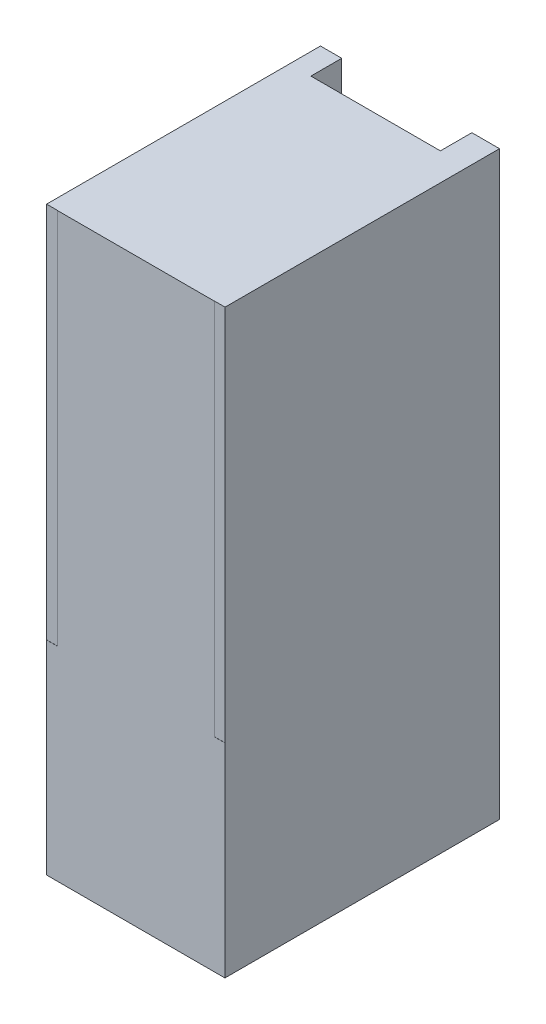
ISO-10303-21;
HEADER;
FILE_DESCRIPTION(('STEP AP214'),'2;1');
FILE_NAME('part.step','',(''),(''),'','','');
FILE_SCHEMA(('AUTOMOTIVE_DESIGN { 1 0 10303 214 1 1 1 1 }'));
ENDSEC;
DATA;
#1=APPLICATION_CONTEXT('core data for automotive mechanical design processes');
#2=APPLICATION_PROTOCOL_DEFINITION('international standard','automotive_design',2000,#1);
#3=PRODUCT_CONTEXT('',#1,'mechanical');
#4=PRODUCT('Part','Part','',(#3));
#5=PRODUCT_RELATED_PRODUCT_CATEGORY('part','',(#4));
#6=PRODUCT_DEFINITION_FORMATION('','',#4);
#7=PRODUCT_DEFINITION_CONTEXT('part definition',#1,'design');
#8=PRODUCT_DEFINITION('design','',#6,#7);
#9=PRODUCT_DEFINITION_SHAPE('','',#8);
#10=(LENGTH_UNIT() NAMED_UNIT(*) SI_UNIT(.MILLI.,.METRE.));
#11=(NAMED_UNIT(*) PLANE_ANGLE_UNIT() SI_UNIT($,.RADIAN.));
#12=(NAMED_UNIT(*) SI_UNIT($,.STERADIAN.) SOLID_ANGLE_UNIT());
#13=UNCERTAINTY_MEASURE_WITH_UNIT(LENGTH_MEASURE(1.E-05),#10,'distance_accuracy_value','');
#14=(GEOMETRIC_REPRESENTATION_CONTEXT(3) GLOBAL_UNCERTAINTY_ASSIGNED_CONTEXT((#13)) GLOBAL_UNIT_ASSIGNED_CONTEXT((#10,
#11,#12)) REPRESENTATION_CONTEXT('',''));
#15=CARTESIAN_POINT('',(0.,0.,0.));
#16=DIRECTION('',(0.,0.,1.));
#17=DIRECTION('',(1.,0.,0.));
#18=AXIS2_PLACEMENT_3D('',#15,#16,#17);
#19=CARTESIAN_POINT('',(4668.57723500689,-4124.1675232722,73.1581251567649));
#20=DIRECTION('',(0.,0.,-1.));
#21=DIRECTION('',(0.,1.,0.));
#22=AXIS2_PLACEMENT_3D('',#19,#20,#21);
#23=PLANE('',#22);
#24=DIRECTION('',(0.,-1.,0.));
#25=VECTOR('',#24,1.);
#26=CARTESIAN_POINT('',(4668.57723500689,-4124.1675232722,73.1581251567649));
#27=LINE('',#26,#25);
#28=CARTESIAN_POINT('',(4668.57723500689,-4242.94271249301,73.158125156767));
#29=VERTEX_POINT('',#28);
#30=CARTESIAN_POINT('',(4668.57723500689,-4304.10271249301,73.1581251567648));
#31=VERTEX_POINT('',#30);
#32=EDGE_CURVE('E38',#29,#31,#27,.T.);
#33=ORIENTED_EDGE('',*,*,#32,.F.);
#34=DIRECTION('',(-1.,0.,0.));
#35=VECTOR('',#34,1.);
#36=CARTESIAN_POINT('',(4668.57723500689,-4242.94271249301,73.1581251567649));
#37=LINE('',#36,#35);
#38=CARTESIAN_POINT('',(4643.17723500689,-4242.94271249301,73.1581251567649));
#39=VERTEX_POINT('',#38);
#40=EDGE_CURVE('E163',#29,#39,#37,.T.);
#41=ORIENTED_EDGE('',*,*,#40,.T.);
#42=DIRECTION('',(0.,-1.,0.));
#43=VECTOR('',#42,1.);
#44=CARTESIAN_POINT('',(4643.17723500689,-4124.1675232722,73.1581251567649));
#45=LINE('',#44,#43);
#46=CARTESIAN_POINT('',(4643.17723500689,-4304.10271249301,73.1581251567648));
#47=VERTEX_POINT('',#46);
#48=EDGE_CURVE('E168',#39,#47,#45,.T.);
#49=ORIENTED_EDGE('',*,*,#48,.T.);
#50=DIRECTION('',(-1.,0.,0.));
#51=VECTOR('',#50,1.);
#52=CARTESIAN_POINT('',(4670.29229527073,-4304.10271249301,73.1581251567648));
#53=LINE('',#52,#51);
#54=CARTESIAN_POINT('',(4641.36966826011,-4304.10271249301,73.1581251567648));
#55=VERTEX_POINT('',#54);
#56=EDGE_CURVE('E188',#47,#55,#53,.T.);
#57=ORIENTED_EDGE('',*,*,#56,.T.);
#58=DIRECTION('',(0.,-1.,0.));
#59=VECTOR('',#58,1.);
#60=CARTESIAN_POINT('',(4641.36966826011,-4304.10271249301,73.1581251567648));
#61=LINE('',#60,#59);
#62=CARTESIAN_POINT('',(4641.36966826011,-4337.10271249301,73.1581251567648));
#63=VERTEX_POINT('',#62);
#64=EDGE_CURVE('E186',#55,#63,#61,.T.);
#65=ORIENTED_EDGE('',*,*,#64,.T.);
#66=DIRECTION('',(-1.,0.,0.));
#67=VECTOR('',#66,1.);
#68=CARTESIAN_POINT('',(4641.36966826011,-4337.10271249301,73.1581251567648));
#69=LINE('',#68,#67);
#70=CARTESIAN_POINT('',(4670.29229527073,-4337.10271249301,73.1581251567648));
#71=VERTEX_POINT('',#70);
#72=EDGE_CURVE('E11',#71,#63,#69,.T.);
#73=ORIENTED_EDGE('',*,*,#72,.F.);
#74=DIRECTION('',(0.,-1.,0.));
#75=VECTOR('',#74,1.);
#76=CARTESIAN_POINT('',(4670.29229527073,-4304.10271249301,73.1581251567648));
#77=LINE('',#76,#75);
#78=CARTESIAN_POINT('',(4670.29229527073,-4304.10271249301,73.1581251567648));
#79=VERTEX_POINT('',#78);
#80=EDGE_CURVE('E181',#79,#71,#77,.T.);
#81=ORIENTED_EDGE('',*,*,#80,.F.);
#82=EDGE_CURVE('E179',#79,#31,#53,.T.);
#83=ORIENTED_EDGE('',*,*,#82,.T.);
#84=EDGE_LOOP('',(#33,#41,#49,#57,#65,#73,#81,#83));
#85=FACE_BOUND('',#84,.T.);
#86=ADVANCED_FACE('F34',(#85),#23,.F.);
#87=CARTESIAN_POINT('',(4655.23098177488,-4300.69152032911,38.7485333618752));
#88=DIRECTION('',(0.,0.,-1.));
#89=DIRECTION('',(0.,1.,0.));
#90=AXIS2_PLACEMENT_3D('',#87,#88,#89);
#91=PLANE('',#90);
#92=CARTESIAN_POINT('',(4655.23098177488,-4300.69152032911,38.7485333618752));
#93=DIRECTION('',(0.,0.,-1.));
#94=DIRECTION('',(0.,1.,0.));
#95=AXIS2_PLACEMENT_3D('',#92,#93,#94);
#96=CIRCLE('',#95,1.40000000000023);
#97=CARTESIAN_POINT('',(4655.23098177488,-4299.29152032911,38.7485333618752));
#98=VERTEX_POINT('',#97);
#99=EDGE_CURVE('E185',#98,#98,#96,.T.);
#100=ORIENTED_EDGE('',*,*,#99,.T.);
#101=EDGE_LOOP('',(#100));
#102=FACE_BOUND('',#101,.T.);
#103=ADVANCED_FACE('F362',(#102),#91,.T.);
#104=CARTESIAN_POINT('',(4655.23098177488,-4254.89152032911,38.7485333618752));
#105=DIRECTION('',(0.,0.,-1.));
#106=DIRECTION('',(0.,1.,0.));
#107=AXIS2_PLACEMENT_3D('',#104,#105,#106);
#108=PLANE('',#107);
#109=CARTESIAN_POINT('',(4655.23098177488,-4254.89152032911,38.7485333618752));
#110=DIRECTION('',(0.,0.,-1.));
#111=DIRECTION('',(0.,1.,0.));
#112=AXIS2_PLACEMENT_3D('',#109,#110,#111);
#113=CIRCLE('',#112,1.40000000000023);
#114=CARTESIAN_POINT('',(4655.23098177488,-4253.49152032911,38.7485333618752));
#115=VERTEX_POINT('',#114);
#116=EDGE_CURVE('E190',#115,#115,#113,.T.);
#117=ORIENTED_EDGE('',*,*,#116,.T.);
#118=EDGE_LOOP('',(#117));
#119=FACE_BOUND('',#118,.T.);
#120=ADVANCED_FACE('F364',(#119),#108,.T.);
#121=CARTESIAN_POINT('',(4655.23098177488,-4300.69152032911,38.7485333618752));
#122=DIRECTION('',(0.,0.,-1.));
#123=DIRECTION('',(0.,1.,0.));
#124=AXIS2_PLACEMENT_3D('',#121,#122,#123);
#125=CYLINDRICAL_SURFACE('',#124,1.40000000000023);
#126=ORIENTED_EDGE('',*,*,#99,.F.);
#127=EDGE_LOOP('',(#126));
#128=FACE_BOUND('',#127,.T.);
#129=CARTESIAN_POINT('',(4655.23098177488,-4300.69152032911,33.7485333618752));
#130=DIRECTION('',(0.,0.,-1.));
#131=DIRECTION('',(0.,1.,0.));
#132=AXIS2_PLACEMENT_3D('',#129,#130,#131);
#133=CIRCLE('',#132,1.40000000000023);
#134=CARTESIAN_POINT('',(4655.23098177488,-4299.29152032911,33.7485333618752));
#135=VERTEX_POINT('',#134);
#136=EDGE_CURVE('E217',#135,#135,#133,.T.);
#137=ORIENTED_EDGE('',*,*,#136,.T.);
#138=EDGE_LOOP('',(#137));
#139=FACE_BOUND('',#138,.T.);
#140=ADVANCED_FACE('F371',(#128,#139),#125,.F.);
#141=CARTESIAN_POINT('',(4655.23098177488,-4254.89152032911,38.7485333618752));
#142=DIRECTION('',(0.,0.,-1.));
#143=DIRECTION('',(0.,1.,0.));
#144=AXIS2_PLACEMENT_3D('',#141,#142,#143);
#145=CYLINDRICAL_SURFACE('',#144,1.40000000000023);
#146=ORIENTED_EDGE('',*,*,#116,.F.);
#147=EDGE_LOOP('',(#146));
#148=FACE_BOUND('',#147,.T.);
#149=CARTESIAN_POINT('',(4655.23098177488,-4254.89152032911,33.7485333618752));
#150=DIRECTION('',(0.,0.,-1.));
#151=DIRECTION('',(0.,1.,0.));
#152=AXIS2_PLACEMENT_3D('',#149,#150,#151);
#153=CIRCLE('',#152,1.40000000000023);
#154=CARTESIAN_POINT('',(4655.23098177488,-4253.49152032911,33.7485333618752));
#155=VERTEX_POINT('',#154);
#156=EDGE_CURVE('E261',#155,#155,#153,.T.);
#157=ORIENTED_EDGE('',*,*,#156,.T.);
#158=EDGE_LOOP('',(#157));
#159=FACE_BOUND('',#158,.T.);
#160=ADVANCED_FACE('F377',(#148,#159),#145,.F.);
#161=CARTESIAN_POINT('',(4647.83098176542,-4242.94271249301,28.7485333618752));
#162=DIRECTION('',(-1.,0.,0.));
#163=DIRECTION('',(0.,-1.,0.));
#164=AXIS2_PLACEMENT_3D('',#161,#162,#163);
#165=PLANE('',#164);
#166=DIRECTION('',(0.,-1.,0.));
#167=VECTOR('',#166,1.);
#168=CARTESIAN_POINT('',(4647.83098176542,-4242.94271249301,28.7485333618752));
#169=LINE('',#168,#167);
#170=CARTESIAN_POINT('',(4647.83098176542,-4314.73310531339,28.7485333618752));
#171=VERTEX_POINT('',#170);
#172=CARTESIAN_POINT('',(4647.83098176542,-4334.10271249301,28.7485333618752));
#173=VERTEX_POINT('',#172);
#174=EDGE_CURVE('E285',#171,#173,#169,.T.);
#175=ORIENTED_EDGE('',*,*,#174,.F.);
#176=DIRECTION('',(0.,0.,1.));
#177=VECTOR('',#176,1.);
#178=CARTESIAN_POINT('',(4647.83098176542,-4314.73310531339,28.7485333618752));
#179=LINE('',#178,#177);
#180=CARTESIAN_POINT('',(4647.83098176542,-4314.73310531339,33.7485333618752));
#181=VERTEX_POINT('',#180);
#182=EDGE_CURVE('E252',#171,#181,#179,.T.);
#183=ORIENTED_EDGE('',*,*,#182,.T.);
#184=DIRECTION('',(0.,-1.,0.));
#185=VECTOR('',#184,1.);
#186=CARTESIAN_POINT('',(4647.83098176542,-4242.94271249301,33.7485333618752));
#187=LINE('',#186,#185);
#188=CARTESIAN_POINT('',(4647.83098176542,-4334.10271249301,33.7485333618752));
#189=VERTEX_POINT('',#188);
#190=EDGE_CURVE('E255',#181,#189,#187,.T.);
#191=ORIENTED_EDGE('',*,*,#190,.T.);
#192=DIRECTION('',(0.,0.,-1.));
#193=VECTOR('',#192,1.);
#194=CARTESIAN_POINT('',(4647.83098176542,-4334.10271249301,28.7485333618752));
#195=LINE('',#194,#193);
#196=EDGE_CURVE('E249',#189,#173,#195,.T.);
#197=ORIENTED_EDGE('',*,*,#196,.T.);
#198=EDGE_LOOP('',(#175,#183,#191,#197));
#199=FACE_BOUND('',#198,.T.);
#200=ADVANCED_FACE('F379',(#199),#165,.F.);
#201=CARTESIAN_POINT('',(4665.80854313187,-4314.73310531339,108.544964758137));
#202=DIRECTION('',(0.,-1.,0.));
#203=DIRECTION('',(0.,0.,-1.));
#204=AXIS2_PLACEMENT_3D('',#201,#202,#203);
#205=PLANE('',#204);
#206=DIRECTION('',(1.,0.,0.));
#207=VECTOR('',#206,1.);
#208=CARTESIAN_POINT('',(4647.83098176542,-4314.73310531339,28.7485333618752));
#209=LINE('',#208,#207);
#210=CARTESIAN_POINT('',(4644.81698177233,-4314.73310531339,28.7485333618752));
#211=VERTEX_POINT('',#210);
#212=EDGE_CURVE('E289',#211,#171,#209,.T.);
#213=ORIENTED_EDGE('',*,*,#212,.F.);
#214=DIRECTION('',(0.,0.,-1.));
#215=VECTOR('',#214,1.);
#216=CARTESIAN_POINT('',(4644.81698177233,-4314.73310531339,108.544964758137));
#217=LINE('',#216,#215);
#218=CARTESIAN_POINT('',(4644.81698177233,-4314.73310531339,33.7485333618752));
#219=VERTEX_POINT('',#218);
#220=EDGE_CURVE('E246',#219,#211,#217,.T.);
#221=ORIENTED_EDGE('',*,*,#220,.F.);
#222=DIRECTION('',(-1.,0.,0.));
#223=VECTOR('',#222,1.);
#224=CARTESIAN_POINT('',(4665.80854313187,-4314.73310531339,33.7485333618752));
#225=LINE('',#224,#223);
#226=EDGE_CURVE('E229',#181,#219,#225,.T.);
#227=ORIENTED_EDGE('',*,*,#226,.F.);
#228=ORIENTED_EDGE('',*,*,#182,.F.);
#229=EDGE_LOOP('',(#213,#221,#227,#228));
#230=FACE_BOUND('',#229,.T.);
#231=ADVANCED_FACE('F385',(#230),#205,.F.);
#232=CARTESIAN_POINT('',(4665.80854313187,-4314.73310531339,33.7485333618752));
#233=VERTEX_POINT('',#232);
#234=CARTESIAN_POINT('',(4663.83098176542,-4314.73310531339,33.7485333618752));
#235=VERTEX_POINT('',#234);
#236=EDGE_CURVE('E230',#233,#235,#225,.T.);
#237=ORIENTED_EDGE('',*,*,#236,.F.);
#238=DIRECTION('',(0.,0.,-1.));
#239=VECTOR('',#238,1.);
#240=CARTESIAN_POINT('',(4665.80854313187,-4314.73310531339,108.544964758137));
#241=LINE('',#240,#239);
#242=CARTESIAN_POINT('',(4665.80854313187,-4314.73310531339,28.6478996226722));
#243=VERTEX_POINT('',#242);
#244=EDGE_CURVE('E225',#233,#243,#241,.T.);
#245=ORIENTED_EDGE('',*,*,#244,.T.);
#246=DIRECTION('',(-1.,0.,0.));
#247=VECTOR('',#246,1.);
#248=CARTESIAN_POINT('',(4665.80854313187,-4314.73310531339,28.6478996226722));
#249=LINE('',#248,#247);
#250=CARTESIAN_POINT('',(4663.83098176543,-4314.73310531339,28.6478996226722));
#251=VERTEX_POINT('',#250);
#252=EDGE_CURVE('E222',#243,#251,#249,.T.);
#253=ORIENTED_EDGE('',*,*,#252,.T.);
#254=DIRECTION('',(1.21891695342006E-12,0.,-1.));
#255=VECTOR('',#254,1.);
#256=CARTESIAN_POINT('',(4663.83098176542,-4314.73310531339,33.7485333618752));
#257=LINE('',#256,#255);
#258=EDGE_CURVE('E257',#235,#251,#257,.T.);
#259=ORIENTED_EDGE('',*,*,#258,.F.);
#260=EDGE_LOOP('',(#237,#245,#253,#259));
#261=FACE_BOUND('',#260,.T.);
#262=ADVANCED_FACE('F553',(#261),#205,.F.);
#263=CARTESIAN_POINT('',(4663.83098176542,-4242.94271249301,33.7485333618752));
#264=DIRECTION('',(1.,0.,1.21891695342006E-12));
#265=DIRECTION('',(1.21891695342006E-12,0.,-1.));
#266=AXIS2_PLACEMENT_3D('',#263,#264,#265);
#267=PLANE('',#266);
#268=DIRECTION('',(0.,-1.,0.));
#269=VECTOR('',#268,1.);
#270=CARTESIAN_POINT('',(4663.83098176542,-4242.94271249301,33.7485333618752));
#271=LINE('',#270,#269);
#272=CARTESIAN_POINT('',(4663.83098176542,-4334.10271249301,33.7485333618752));
#273=VERTEX_POINT('',#272);
#274=EDGE_CURVE('E233',#235,#273,#271,.T.);
#275=ORIENTED_EDGE('',*,*,#274,.F.);
#276=ORIENTED_EDGE('',*,*,#258,.T.);
#277=DIRECTION('',(0.,-1.,0.));
#278=VECTOR('',#277,1.);
#279=CARTESIAN_POINT('',(4663.83098176543,-4242.94271249301,28.6478996226722));
#280=LINE('',#279,#278);
#281=CARTESIAN_POINT('',(4663.83098176542,-4334.10271249301,28.6478996226722));
#282=VERTEX_POINT('',#281);
#283=EDGE_CURVE('E260',#251,#282,#280,.T.);
#284=ORIENTED_EDGE('',*,*,#283,.T.);
#285=DIRECTION('',(-1.21891695342006E-12,0.,1.));
#286=VECTOR('',#285,1.);
#287=CARTESIAN_POINT('',(4663.83098176542,-4334.10271249301,33.7485333618752));
#288=LINE('',#287,#286);
#289=EDGE_CURVE('E251',#282,#273,#288,.T.);
#290=ORIENTED_EDGE('',*,*,#289,.T.);
#291=EDGE_LOOP('',(#275,#276,#284,#290));
#292=FACE_BOUND('',#291,.T.);
#293=ADVANCED_FACE('F413',(#292),#267,.F.);
#294=CARTESIAN_POINT('',(4665.80854313187,-4242.94271249301,108.544964758137));
#295=DIRECTION('',(1.,0.,0.));
#296=DIRECTION('',(0.,0.,-1.));
#297=AXIS2_PLACEMENT_3D('',#294,#295,#296);
#298=PLANE('',#297);
#299=DIRECTION('',(0.,0.,-1.));
#300=VECTOR('',#299,1.);
#301=CARTESIAN_POINT('',(4665.80854313187,-4242.94271249301,108.544964758137));
#302=LINE('',#301,#300);
#303=CARTESIAN_POINT('',(4665.80854313187,-4242.94271249301,33.7485333618752));
#304=VERTEX_POINT('',#303);
#305=CARTESIAN_POINT('',(4665.80854313187,-4242.94271249301,28.6478996226722));
#306=VERTEX_POINT('',#305);
#307=EDGE_CURVE('E224',#304,#306,#302,.T.);
#308=ORIENTED_EDGE('',*,*,#307,.T.);
#309=DIRECTION('',(0.,-1.,0.));
#310=VECTOR('',#309,1.);
#311=CARTESIAN_POINT('',(4665.80854313187,-4242.94271249301,28.6478996226722));
#312=LINE('',#311,#310);
#313=EDGE_CURVE('E226',#306,#243,#312,.T.);
#314=ORIENTED_EDGE('',*,*,#313,.T.);
#315=ORIENTED_EDGE('',*,*,#244,.F.);
#316=DIRECTION('',(0.,-1.,0.));
#317=VECTOR('',#316,1.);
#318=CARTESIAN_POINT('',(4665.80854313187,-4242.94271249301,33.7485333618752));
#319=LINE('',#318,#317);
#320=EDGE_CURVE('E234',#304,#233,#319,.T.);
#321=ORIENTED_EDGE('',*,*,#320,.F.);
#322=EDGE_LOOP('',(#308,#314,#315,#321));
#323=FACE_BOUND('',#322,.T.);
#324=ADVANCED_FACE('F408',(#323),#298,.F.);
#325=CARTESIAN_POINT('',(4644.81698177233,-4242.94271249301,108.544964758137));
#326=DIRECTION('',(-1.,0.,0.));
#327=DIRECTION('',(0.,0.,1.));
#328=AXIS2_PLACEMENT_3D('',#325,#326,#327);
#329=PLANE('',#328);
#330=DIRECTION('',(0.,0.,-1.));
#331=VECTOR('',#330,1.);
#332=CARTESIAN_POINT('',(4644.81698177233,-4242.94271249301,108.544964758137));
#333=LINE('',#332,#331);
#334=CARTESIAN_POINT('',(4644.81698177233,-4242.94271249301,33.7485333618752));
#335=VERTEX_POINT('',#334);
#336=CARTESIAN_POINT('',(4644.81698177233,-4242.94271249301,28.7485333618752));
#337=VERTEX_POINT('',#336);
#338=EDGE_CURVE('E241',#335,#337,#333,.T.);
#339=ORIENTED_EDGE('',*,*,#338,.F.);
#340=DIRECTION('',(0.,1.,0.));
#341=VECTOR('',#340,1.);
#342=CARTESIAN_POINT('',(4644.81698177233,-4242.94271249301,33.7485333618752));
#343=LINE('',#342,#341);
#344=EDGE_CURVE('E237',#219,#335,#343,.T.);
#345=ORIENTED_EDGE('',*,*,#344,.F.);
#346=ORIENTED_EDGE('',*,*,#220,.T.);
#347=DIRECTION('',(0.,-1.,0.));
#348=VECTOR('',#347,1.);
#349=CARTESIAN_POINT('',(4644.81698177233,-4242.94271249301,28.7485333618752));
#350=LINE('',#349,#348);
#351=EDGE_CURVE('E248',#337,#211,#350,.T.);
#352=ORIENTED_EDGE('',*,*,#351,.F.);
#353=EDGE_LOOP('',(#339,#345,#346,#352));
#354=FACE_BOUND('',#353,.T.);
#355=ADVANCED_FACE('F397',(#354),#329,.F.);
#356=CARTESIAN_POINT('',(4663.83098176542,-4242.94271249301,33.7485333618752));
#357=DIRECTION('',(0.,0.,1.));
#358=DIRECTION('',(0.,-1.,0.));
#359=AXIS2_PLACEMENT_3D('',#356,#357,#358);
#360=PLANE('',#359);
#361=ORIENTED_EDGE('',*,*,#190,.F.);
#362=ORIENTED_EDGE('',*,*,#226,.T.);
#363=ORIENTED_EDGE('',*,*,#344,.T.);
#364=DIRECTION('',(-1.,0.,0.));
#365=VECTOR('',#364,1.);
#366=CARTESIAN_POINT('',(4663.83098176542,-4242.94271249301,33.7485333618752));
#367=LINE('',#366,#365);
#368=EDGE_CURVE('E245',#304,#335,#367,.T.);
#369=ORIENTED_EDGE('',*,*,#368,.F.);
#370=ORIENTED_EDGE('',*,*,#320,.T.);
#371=ORIENTED_EDGE('',*,*,#236,.T.);
#372=ORIENTED_EDGE('',*,*,#274,.T.);
#373=DIRECTION('',(-1.,0.,0.));
#374=VECTOR('',#373,1.);
#375=CARTESIAN_POINT('',(4663.83098176542,-4334.10271249301,33.7485333618752));
#376=LINE('',#375,#374);
#377=EDGE_CURVE('E256',#273,#189,#376,.T.);
#378=ORIENTED_EDGE('',*,*,#377,.T.);
#379=EDGE_LOOP('',(#361,#362,#363,#369,#370,#371,#372,#378));
#380=FACE_BOUND('',#379,.T.);
#381=ORIENTED_EDGE('',*,*,#156,.F.);
#382=EDGE_LOOP('',(#381));
#383=FACE_BOUND('',#382,.T.);
#384=ORIENTED_EDGE('',*,*,#136,.F.);
#385=EDGE_LOOP('',(#384));
#386=FACE_BOUND('',#385,.T.);
#387=ADVANCED_FACE('F393',(#380,#383,#386),#360,.F.);
#388=CARTESIAN_POINT('',(-45.977206948798,-4334.10271249301,16.9775327188837));
#389=DIRECTION('',(0.,-1.,0.));
#390=DIRECTION('',(0.,0.,-1.));
#391=AXIS2_PLACEMENT_3D('',#388,#389,#390);
#392=PLANE('',#391);
#393=DIRECTION('',(-1.,0.,0.));
#394=VECTOR('',#393,1.);
#395=CARTESIAN_POINT('',(4647.83098176542,-4334.10271249301,28.7485333618752));
#396=LINE('',#395,#394);
#397=CARTESIAN_POINT('',(4641.36966826011,-4334.10271249301,28.7485333618752));
#398=VERTEX_POINT('',#397);
#399=EDGE_CURVE('E288',#173,#398,#396,.T.);
#400=ORIENTED_EDGE('',*,*,#399,.F.);
#401=ORIENTED_EDGE('',*,*,#196,.F.);
#402=ORIENTED_EDGE('',*,*,#377,.F.);
#403=ORIENTED_EDGE('',*,*,#289,.F.);
#404=DIRECTION('',(1.,0.,0.));
#405=VECTOR('',#404,1.);
#406=CARTESIAN_POINT('',(4641.36966826011,-4334.10271249301,28.6478996226722));
#407=LINE('',#406,#405);
#408=CARTESIAN_POINT('',(4641.36966826011,-4334.10271249301,28.6478996226722));
#409=VERTEX_POINT('',#408);
#410=EDGE_CURVE('E214',#409,#282,#407,.T.);
#411=ORIENTED_EDGE('',*,*,#410,.F.);
#412=DIRECTION('',(0.,0.,-1.));
#413=VECTOR('',#412,1.);
#414=CARTESIAN_POINT('',(4641.36966826011,-4334.10271249301,73.1581251567648));
#415=LINE('',#414,#413);
#416=EDGE_CURVE('E210',#398,#409,#415,.T.);
#417=ORIENTED_EDGE('',*,*,#416,.F.);
#418=EDGE_LOOP('',(#400,#401,#402,#403,#411,#417));
#419=FACE_BOUND('',#418,.T.);
#420=ADVANCED_FACE('F396',(#419),#392,.F.);
#421=CARTESIAN_POINT('',(4647.83098176542,-4242.94271249301,28.7485333618752));
#422=DIRECTION('',(0.,0.,1.));
#423=DIRECTION('',(0.,-1.,0.));
#424=AXIS2_PLACEMENT_3D('',#421,#422,#423);
#425=PLANE('',#424);
#426=ORIENTED_EDGE('',*,*,#351,.T.);
#427=ORIENTED_EDGE('',*,*,#212,.T.);
#428=ORIENTED_EDGE('',*,*,#174,.T.);
#429=ORIENTED_EDGE('',*,*,#399,.T.);
#430=DIRECTION('',(0.,-1.,0.));
#431=VECTOR('',#430,1.);
#432=CARTESIAN_POINT('',(4641.36966826011,-4242.94271249301,28.7485333618752));
#433=LINE('',#432,#431);
#434=CARTESIAN_POINT('',(4641.36966826011,-4242.94271249301,28.7485333618752));
#435=VERTEX_POINT('',#434);
#436=EDGE_CURVE('E213',#435,#398,#433,.T.);
#437=ORIENTED_EDGE('',*,*,#436,.F.);
#438=DIRECTION('',(-1.,0.,0.));
#439=VECTOR('',#438,1.);
#440=CARTESIAN_POINT('',(4647.83098176542,-4242.94271249301,28.7485333618752));
#441=LINE('',#440,#439);
#442=EDGE_CURVE('E244',#337,#435,#441,.T.);
#443=ORIENTED_EDGE('',*,*,#442,.F.);
#444=EDGE_LOOP('',(#426,#427,#428,#429,#437,#443));
#445=FACE_BOUND('',#444,.T.);
#446=ADVANCED_FACE('F358',(#445),#425,.F.);
#447=CARTESIAN_POINT('',(4668.57723500689,-4124.1675232722,55.9775327188838));
#448=DIRECTION('',(-1.,0.,0.));
#449=DIRECTION('',(0.,-1.,0.));
#450=AXIS2_PLACEMENT_3D('',#447,#448,#449);
#451=PLANE('',#450);
#452=DIRECTION('',(0.,1.,0.));
#453=VECTOR('',#452,1.);
#454=CARTESIAN_POINT('',(4668.57723500689,-4242.94271249301,73.1375391580691));
#455=LINE('',#454,#453);
#456=CARTESIAN_POINT('',(4668.57723500689,-4304.10271249301,73.137539158069));
#457=VERTEX_POINT('',#456);
#458=CARTESIAN_POINT('',(4668.57723500689,-4242.94271249301,73.1375391580691));
#459=VERTEX_POINT('',#458);
#460=EDGE_CURVE('E174',#457,#459,#455,.T.);
#461=ORIENTED_EDGE('',*,*,#460,.T.);
#462=DIRECTION('',(0.,0.,1.));
#463=VECTOR('',#462,1.);
#464=CARTESIAN_POINT('',(4668.57723500689,-4242.94271249301,55.9775327188838));
#465=LINE('',#464,#463);
#466=EDGE_CURVE('E161',#459,#29,#465,.T.);
#467=ORIENTED_EDGE('',*,*,#466,.T.);
#468=ORIENTED_EDGE('',*,*,#32,.T.);
#469=DIRECTION('',(0.,0.,1.));
#470=VECTOR('',#469,1.);
#471=CARTESIAN_POINT('',(4668.57723500689,-4304.10271249301,55.9775327188838));
#472=LINE('',#471,#470);
#473=EDGE_CURVE('E273',#457,#31,#472,.T.);
#474=ORIENTED_EDGE('',*,*,#473,.F.);
#475=EDGE_LOOP('',(#461,#467,#468,#474));
#476=FACE_BOUND('',#475,.T.);
#477=ADVANCED_FACE('F171',(#476),#451,.F.);
#478=CARTESIAN_POINT('',(-45.977206948798,-4304.10271249301,16.9775327188837));
#479=DIRECTION('',(0.,-1.,0.));
#480=DIRECTION('',(0.,0.,-1.));
#481=AXIS2_PLACEMENT_3D('',#478,#479,#480);
#482=PLANE('',#481);
#483=DIRECTION('',(1.,0.,0.));
#484=VECTOR('',#483,1.);
#485=CARTESIAN_POINT('',(4641.36966826011,-4304.10271249301,73.1375391580691));
#486=LINE('',#485,#484);
#487=CARTESIAN_POINT('',(4670.29229527073,-4304.10271249301,73.137539158069));
#488=VERTEX_POINT('',#487);
#489=EDGE_CURVE('E266',#457,#488,#486,.T.);
#490=ORIENTED_EDGE('',*,*,#489,.F.);
#491=ORIENTED_EDGE('',*,*,#473,.T.);
#492=ORIENTED_EDGE('',*,*,#82,.F.);
#493=DIRECTION('',(0.,0.,1.));
#494=VECTOR('',#493,1.);
#495=CARTESIAN_POINT('',(4670.29229527073,-4304.10271249301,73.137539158069));
#496=LINE('',#495,#494);
#497=EDGE_CURVE('E205',#488,#79,#496,.T.);
#498=ORIENTED_EDGE('',*,*,#497,.F.);
#499=EDGE_LOOP('',(#490,#491,#492,#498));
#500=FACE_BOUND('',#499,.T.);
#501=ADVANCED_FACE('F349',(#500),#482,.F.);
#502=CARTESIAN_POINT('',(4663.83098176542,-4242.94271249301,73.1375391580691));
#503=DIRECTION('',(0.,0.,-1.));
#504=DIRECTION('',(0.,1.,0.));
#505=AXIS2_PLACEMENT_3D('',#502,#503,#504);
#506=PLANE('',#505);
#507=ORIENTED_EDGE('',*,*,#489,.T.);
#508=DIRECTION('',(0.,-1.,0.));
#509=VECTOR('',#508,1.);
#510=CARTESIAN_POINT('',(4670.29229527073,-4242.94271249301,73.1375391580691));
#511=LINE('',#510,#509);
#512=CARTESIAN_POINT('',(4670.29229527073,-4242.94271249301,73.1375391580691));
#513=VERTEX_POINT('',#512);
#514=EDGE_CURVE('E267',#513,#488,#511,.T.);
#515=ORIENTED_EDGE('',*,*,#514,.F.);
#516=DIRECTION('',(1.,0.,0.));
#517=VECTOR('',#516,1.);
#518=CARTESIAN_POINT('',(4663.83098176542,-4242.94271249301,73.1375391580691));
#519=LINE('',#518,#517);
#520=EDGE_CURVE('E311',#459,#513,#519,.T.);
#521=ORIENTED_EDGE('',*,*,#520,.F.);
#522=ORIENTED_EDGE('',*,*,#460,.F.);
#523=EDGE_LOOP('',(#507,#515,#521,#522));
#524=FACE_BOUND('',#523,.T.);
#525=ADVANCED_FACE('F347',(#524),#506,.F.);
#526=CARTESIAN_POINT('',(-45.977206948798,-4242.94271249301,16.9775327188837));
#527=DIRECTION('',(0.,1.,0.));
#528=DIRECTION('',(0.,0.,1.));
#529=AXIS2_PLACEMENT_3D('',#526,#527,#528);
#530=PLANE('',#529);
#531=ORIENTED_EDGE('',*,*,#368,.T.);
#532=ORIENTED_EDGE('',*,*,#338,.T.);
#533=ORIENTED_EDGE('',*,*,#442,.T.);
#534=DIRECTION('',(0.,0.,1.));
#535=VECTOR('',#534,1.);
#536=CARTESIAN_POINT('',(4641.36966826011,-4242.94271249301,28.7485333618752));
#537=LINE('',#536,#535);
#538=CARTESIAN_POINT('',(4641.36966826011,-4242.94271249301,73.1375391580691));
#539=VERTEX_POINT('',#538);
#540=EDGE_CURVE('E301',#435,#539,#537,.T.);
#541=ORIENTED_EDGE('',*,*,#540,.T.);
#542=CARTESIAN_POINT('',(4643.17723500689,-4242.94271249301,73.1375391580691));
#543=VERTEX_POINT('',#542);
#544=EDGE_CURVE('E304',#539,#543,#519,.T.);
#545=ORIENTED_EDGE('',*,*,#544,.T.);
#546=DIRECTION('',(0.,0.,-1.));
#547=VECTOR('',#546,1.);
#548=CARTESIAN_POINT('',(4643.17723500689,-4242.94271249301,55.9775327188838));
#549=LINE('',#548,#547);
#550=EDGE_CURVE('E53',#39,#543,#549,.T.);
#551=ORIENTED_EDGE('',*,*,#550,.F.);
#552=ORIENTED_EDGE('',*,*,#40,.F.);
#553=ORIENTED_EDGE('',*,*,#466,.F.);
#554=ORIENTED_EDGE('',*,*,#520,.T.);
#555=DIRECTION('',(0.,0.,-1.));
#556=VECTOR('',#555,1.);
#557=CARTESIAN_POINT('',(4670.29229527073,-4242.94271249301,73.1375391580691));
#558=LINE('',#557,#556);
#559=CARTESIAN_POINT('',(4670.29229527073,-4242.94271249301,28.6478996226722));
#560=VERTEX_POINT('',#559);
#561=EDGE_CURVE('E309',#513,#560,#558,.T.);
#562=ORIENTED_EDGE('',*,*,#561,.T.);
#563=DIRECTION('',(-1.,0.,0.));
#564=VECTOR('',#563,1.);
#565=CARTESIAN_POINT('',(4663.83098176543,-4242.94271249301,28.6478996226722));
#566=LINE('',#565,#564);
#567=EDGE_CURVE('E265',#560,#306,#566,.T.);
#568=ORIENTED_EDGE('',*,*,#567,.T.);
#569=ORIENTED_EDGE('',*,*,#307,.F.);
#570=EDGE_LOOP('',(#531,#532,#533,#541,#545,#551,#552,#553,#554,#562,#568,#569));
#571=FACE_BOUND('',#570,.T.);
#572=ADVANCED_FACE('F164',(#571),#530,.T.);
#573=CARTESIAN_POINT('',(4670.29229527073,-4242.94271249301,73.1375391580691));
#574=DIRECTION('',(-1.,0.,0.));
#575=DIRECTION('',(0.,-1.,0.));
#576=AXIS2_PLACEMENT_3D('',#573,#574,#575);
#577=PLANE('',#576);
#578=ORIENTED_EDGE('',*,*,#80,.T.);
#579=DIRECTION('',(0.,0.,1.));
#580=VECTOR('',#579,1.);
#581=CARTESIAN_POINT('',(4670.29229527073,-4337.10271249301,73.1581251567648));
#582=LINE('',#581,#580);
#583=CARTESIAN_POINT('',(4670.29229527073,-4337.10271249301,28.6478996226722));
#584=VERTEX_POINT('',#583);
#585=EDGE_CURVE('E44',#584,#71,#582,.T.);
#586=ORIENTED_EDGE('',*,*,#585,.F.);
#587=DIRECTION('',(0.,-1.,0.));
#588=VECTOR('',#587,1.);
#589=CARTESIAN_POINT('',(4670.29229527073,-4242.94271249301,28.6478996226722));
#590=LINE('',#589,#588);
#591=EDGE_CURVE('E221',#560,#584,#590,.T.);
#592=ORIENTED_EDGE('',*,*,#591,.F.);
#593=ORIENTED_EDGE('',*,*,#561,.F.);
#594=ORIENTED_EDGE('',*,*,#514,.T.);
#595=ORIENTED_EDGE('',*,*,#497,.T.);
#596=EDGE_LOOP('',(#578,#586,#592,#593,#594,#595));
#597=FACE_BOUND('',#596,.T.);
#598=ADVANCED_FACE('F338',(#597),#577,.F.);
#599=CARTESIAN_POINT('',(4663.83098176543,-4242.94271249301,28.6478996226722));
#600=DIRECTION('',(0.,0.,1.));
#601=DIRECTION('',(0.,-1.,0.));
#602=AXIS2_PLACEMENT_3D('',#599,#600,#601);
#603=PLANE('',#602);
#604=ORIENTED_EDGE('',*,*,#283,.F.);
#605=ORIENTED_EDGE('',*,*,#252,.F.);
#606=ORIENTED_EDGE('',*,*,#313,.F.);
#607=ORIENTED_EDGE('',*,*,#567,.F.);
#608=ORIENTED_EDGE('',*,*,#591,.T.);
#609=DIRECTION('',(1.,0.,0.));
#610=VECTOR('',#609,1.);
#611=CARTESIAN_POINT('',(4641.36966826011,-4337.10271249301,28.6478996226722));
#612=LINE('',#611,#610);
#613=CARTESIAN_POINT('',(4641.36966826011,-4337.10271249301,28.6478996226722));
#614=VERTEX_POINT('',#613);
#615=EDGE_CURVE('E204',#614,#584,#612,.T.);
#616=ORIENTED_EDGE('',*,*,#615,.F.);
#617=DIRECTION('',(0.,1.,0.));
#618=VECTOR('',#617,1.);
#619=CARTESIAN_POINT('',(4641.36966826011,-4337.10271249301,28.6478996226722));
#620=LINE('',#619,#618);
#621=EDGE_CURVE('E218',#614,#409,#620,.T.);
#622=ORIENTED_EDGE('',*,*,#621,.T.);
#623=ORIENTED_EDGE('',*,*,#410,.T.);
#624=EDGE_LOOP('',(#604,#605,#606,#607,#608,#616,#622,#623));
#625=FACE_BOUND('',#624,.T.);
#626=ADVANCED_FACE('F343',(#625),#603,.F.);
#627=CARTESIAN_POINT('',(4641.36966826011,-4242.94271249301,28.7485333618752));
#628=DIRECTION('',(1.,0.,0.));
#629=DIRECTION('',(0.,1.,0.));
#630=AXIS2_PLACEMENT_3D('',#627,#628,#629);
#631=PLANE('',#630);
#632=ORIENTED_EDGE('',*,*,#436,.T.);
#633=ORIENTED_EDGE('',*,*,#416,.T.);
#634=ORIENTED_EDGE('',*,*,#621,.F.);
#635=DIRECTION('',(0.,0.,-1.));
#636=VECTOR('',#635,1.);
#637=CARTESIAN_POINT('',(4641.36966826011,-4337.10271249301,73.1581251567648));
#638=LINE('',#637,#636);
#639=EDGE_CURVE('E201',#63,#614,#638,.T.);
#640=ORIENTED_EDGE('',*,*,#639,.F.);
#641=ORIENTED_EDGE('',*,*,#64,.F.);
#642=DIRECTION('',(0.,0.,1.));
#643=VECTOR('',#642,1.);
#644=CARTESIAN_POINT('',(4641.36966826011,-4304.10271249301,73.1375391580691));
#645=LINE('',#644,#643);
#646=CARTESIAN_POINT('',(4641.36966826011,-4304.10271249301,73.137539158069));
#647=VERTEX_POINT('',#646);
#648=EDGE_CURVE('E322',#647,#55,#645,.T.);
#649=ORIENTED_EDGE('',*,*,#648,.F.);
#650=DIRECTION('',(0.,-1.,0.));
#651=VECTOR('',#650,1.);
#652=CARTESIAN_POINT('',(4641.36966826011,-4242.94271249301,73.1375391580691));
#653=LINE('',#652,#651);
#654=EDGE_CURVE('E264',#539,#647,#653,.T.);
#655=ORIENTED_EDGE('',*,*,#654,.F.);
#656=ORIENTED_EDGE('',*,*,#540,.F.);
#657=EDGE_LOOP('',(#632,#633,#634,#640,#641,#649,#655,#656));
#658=FACE_BOUND('',#657,.T.);
#659=ADVANCED_FACE('F332',(#658),#631,.F.);
#660=CARTESIAN_POINT('',(-45.977206948798,-4337.10271249301,16.9775327188837));
#661=DIRECTION('',(0.,-1.,0.));
#662=DIRECTION('',(0.,0.,-1.));
#663=AXIS2_PLACEMENT_3D('',#660,#661,#662);
#664=PLANE('',#663);
#665=ORIENTED_EDGE('',*,*,#639,.T.);
#666=ORIENTED_EDGE('',*,*,#615,.T.);
#667=ORIENTED_EDGE('',*,*,#585,.T.);
#668=ORIENTED_EDGE('',*,*,#72,.T.);
#669=EDGE_LOOP('',(#665,#666,#667,#668));
#670=FACE_BOUND('',#669,.T.);
#671=ADVANCED_FACE('F335',(#670),#664,.T.);
#672=CARTESIAN_POINT('',(4643.17723500689,-4304.10271249301,73.1375391580691));
#673=VERTEX_POINT('',#672);
#674=EDGE_CURVE('E262',#647,#673,#486,.T.);
#675=ORIENTED_EDGE('',*,*,#674,.T.);
#676=DIRECTION('',(0.,-1.,0.));
#677=VECTOR('',#676,1.);
#678=CARTESIAN_POINT('',(4643.17723500689,-4242.94271249301,73.1375391580691));
#679=LINE('',#678,#677);
#680=EDGE_CURVE('E200',#543,#673,#679,.T.);
#681=ORIENTED_EDGE('',*,*,#680,.F.);
#682=ORIENTED_EDGE('',*,*,#544,.F.);
#683=ORIENTED_EDGE('',*,*,#654,.T.);
#684=EDGE_LOOP('',(#675,#681,#682,#683));
#685=FACE_BOUND('',#684,.T.);
#686=ADVANCED_FACE('F357',(#685),#506,.F.);
#687=CARTESIAN_POINT('',(4643.17723500689,-4124.1675232722,55.9775327188838));
#688=DIRECTION('',(1.,0.,0.));
#689=DIRECTION('',(0.,1.,0.));
#690=AXIS2_PLACEMENT_3D('',#687,#688,#689);
#691=PLANE('',#690);
#692=ORIENTED_EDGE('',*,*,#48,.F.);
#693=ORIENTED_EDGE('',*,*,#550,.T.);
#694=ORIENTED_EDGE('',*,*,#680,.T.);
#695=DIRECTION('',(0.,0.,-1.));
#696=VECTOR('',#695,1.);
#697=CARTESIAN_POINT('',(4643.17723500689,-4304.10271249301,55.9775327188838));
#698=LINE('',#697,#696);
#699=EDGE_CURVE('E212',#47,#673,#698,.T.);
#700=ORIENTED_EDGE('',*,*,#699,.F.);
#701=EDGE_LOOP('',(#692,#693,#694,#700));
#702=FACE_BOUND('',#701,.T.);
#703=ADVANCED_FACE('F36',(#702),#691,.F.);
#704=ORIENTED_EDGE('',*,*,#56,.F.);
#705=ORIENTED_EDGE('',*,*,#699,.T.);
#706=ORIENTED_EDGE('',*,*,#674,.F.);
#707=ORIENTED_EDGE('',*,*,#648,.T.);
#708=EDGE_LOOP('',(#704,#705,#706,#707));
#709=FACE_BOUND('',#708,.T.);
#710=ADVANCED_FACE('F328',(#709),#482,.F.);
#711=CLOSED_SHELL('',(#86,#103,#120,#140,#160,#200,#231,#262,#293,#324,#355,#387,#420,#446,#477,
#501,#525,#572,#598,#626,#659,#671,#686,#703,#710));
#712=MANIFOLD_SOLID_BREP('B2',#711);
#713=ADVANCED_BREP_SHAPE_REPRESENTATION('',(#18,#712),#14);
#714=SHAPE_DEFINITION_REPRESENTATION(#9,#713);
ENDSEC;
END-ISO-10303-21;
